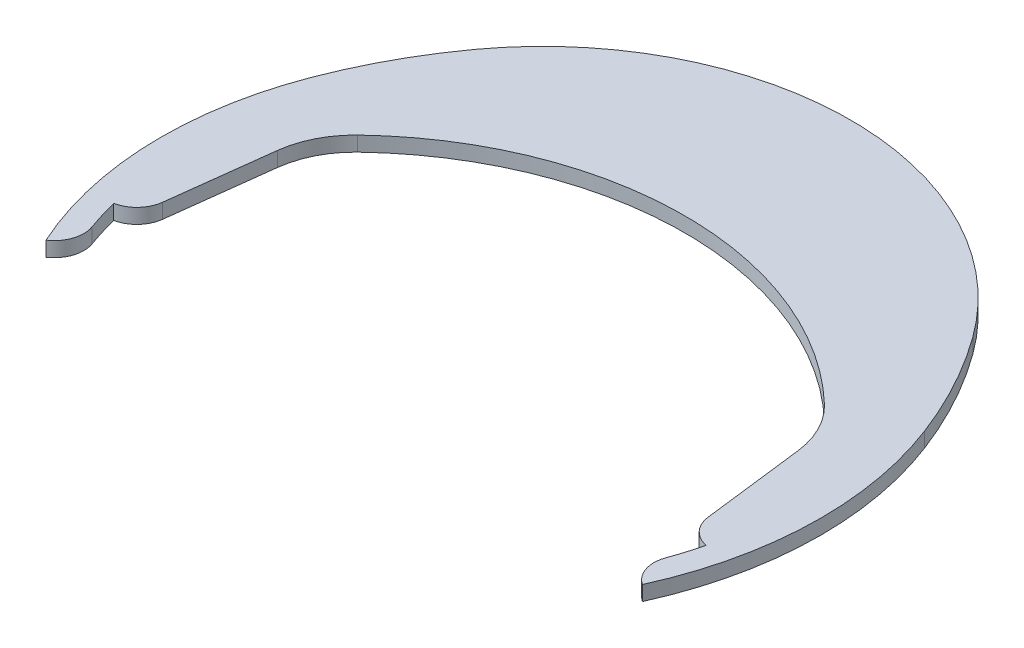
ISO-10303-21;
HEADER;
FILE_DESCRIPTION(('STEP AP214'),'2;1');
FILE_NAME('part.step','',(''),(''),'','','');
FILE_SCHEMA(('AUTOMOTIVE_DESIGN { 1 0 10303 214 1 1 1 1 }'));
ENDSEC;
DATA;
#1=APPLICATION_CONTEXT('core data for automotive mechanical design processes');
#2=APPLICATION_PROTOCOL_DEFINITION('international standard','automotive_design',2000,#1);
#3=PRODUCT_CONTEXT('',#1,'mechanical');
#4=PRODUCT('Part','Part','',(#3));
#5=PRODUCT_RELATED_PRODUCT_CATEGORY('part','',(#4));
#6=PRODUCT_DEFINITION_FORMATION('','',#4);
#7=PRODUCT_DEFINITION_CONTEXT('part definition',#1,'design');
#8=PRODUCT_DEFINITION('design','',#6,#7);
#9=PRODUCT_DEFINITION_SHAPE('','',#8);
#10=(LENGTH_UNIT() NAMED_UNIT(*) SI_UNIT(.MILLI.,.METRE.));
#11=(NAMED_UNIT(*) PLANE_ANGLE_UNIT() SI_UNIT($,.RADIAN.));
#12=(NAMED_UNIT(*) SI_UNIT($,.STERADIAN.) SOLID_ANGLE_UNIT());
#13=UNCERTAINTY_MEASURE_WITH_UNIT(LENGTH_MEASURE(1.E-05),#10,'distance_accuracy_value','');
#14=(GEOMETRIC_REPRESENTATION_CONTEXT(3) GLOBAL_UNCERTAINTY_ASSIGNED_CONTEXT((#13)) GLOBAL_UNIT_ASSIGNED_CONTEXT((#10,
#11,#12)) REPRESENTATION_CONTEXT('',''));
#15=CARTESIAN_POINT('',(0.,0.,0.));
#16=DIRECTION('',(0.,0.,1.));
#17=DIRECTION('',(1.,0.,0.));
#18=AXIS2_PLACEMENT_3D('',#15,#16,#17);
#19=CARTESIAN_POINT('',(0.,15.,-40.));
#20=DIRECTION('',(0.,-1.,0.));
#21=DIRECTION('',(0.,0.,-1.));
#22=AXIS2_PLACEMENT_3D('',#19,#20,#21);
#23=CYLINDRICAL_SURFACE('',#22,104.);
#24=CARTESIAN_POINT('',(0.,10.,-40.));
#25=DIRECTION('',(0.,1.,0.));
#26=DIRECTION('',(0.,0.,1.));
#27=AXIS2_PLACEMENT_3D('',#24,#25,#26);
#28=CIRCLE('',#27,104.);
#29=CARTESIAN_POINT('',(84.137767414994,10.,-101.129666238418));
#30=VERTEX_POINT('',#29);
#31=CARTESIAN_POINT('',(-84.137767414994,10.,-101.129666238418));
#32=VERTEX_POINT('',#31);
#33=EDGE_CURVE('E175',#30,#32,#28,.T.);
#34=ORIENTED_EDGE('',*,*,#33,.T.);
#35=DIRECTION('',(0.,-1.,0.));
#36=VECTOR('',#35,1.);
#37=CARTESIAN_POINT('',(-84.137767414994,15.,-101.129666238418));
#38=LINE('',#37,#36);
#39=CARTESIAN_POINT('',(-84.137767414994,15.,-101.129666238418));
#40=VERTEX_POINT('',#39);
#41=EDGE_CURVE('E11',#40,#32,#38,.T.);
#42=ORIENTED_EDGE('',*,*,#41,.F.);
#43=CARTESIAN_POINT('',(0.,15.,-40.));
#44=DIRECTION('',(0.,1.,0.));
#45=DIRECTION('',(0.,0.,1.));
#46=AXIS2_PLACEMENT_3D('',#43,#44,#45);
#47=CIRCLE('',#46,104.);
#48=CARTESIAN_POINT('',(84.137767414994,15.,-101.129666238418));
#49=VERTEX_POINT('',#48);
#50=EDGE_CURVE('E211',#49,#40,#47,.T.);
#51=ORIENTED_EDGE('',*,*,#50,.F.);
#52=DIRECTION('',(0.,-1.,0.));
#53=VECTOR('',#52,1.);
#54=CARTESIAN_POINT('',(84.137767414994,15.,-101.129666238418));
#55=LINE('',#54,#53);
#56=EDGE_CURVE('E171',#49,#30,#55,.T.);
#57=ORIENTED_EDGE('',*,*,#56,.T.);
#58=EDGE_LOOP('',(#34,#42,#51,#57));
#59=FACE_BOUND('',#58,.T.);
#60=ADVANCED_FACE('F32',(#59),#23,.T.);
#61=CARTESIAN_POINT('',(41.259866713122,15.,-10.0229521330835));
#62=DIRECTION('',(0.,-1.,0.));
#63=DIRECTION('',(0.,0.,-1.));
#64=AXIS2_PLACEMENT_3D('',#61,#62,#63);
#65=CYLINDRICAL_SURFACE('',#64,155.);
#66=CARTESIAN_POINT('',(41.259866713122,10.,-10.0229521330835));
#67=DIRECTION('',(0.,1.,0.));
#68=DIRECTION('',(0.,0.,1.));
#69=AXIS2_PLACEMENT_3D('',#66,#67,#68);
#70=CIRCLE('',#69,155.);
#71=CARTESIAN_POINT('',(-103.445099393944,10.,-65.5699843126063));
#72=VERTEX_POINT('',#71);
#73=EDGE_CURVE('E178',#32,#72,#70,.T.);
#74=ORIENTED_EDGE('',*,*,#73,.T.);
#75=DIRECTION('',(0.,-1.,0.));
#76=VECTOR('',#75,1.);
#77=CARTESIAN_POINT('',(-103.445099393944,15.,-65.5699843126063));
#78=LINE('',#77,#76);
#79=CARTESIAN_POINT('',(-103.445099393944,15.,-65.5699843126063));
#80=VERTEX_POINT('',#79);
#81=EDGE_CURVE('E40',#80,#72,#78,.T.);
#82=ORIENTED_EDGE('',*,*,#81,.F.);
#83=CARTESIAN_POINT('',(41.259866713122,15.,-10.0229521330835));
#84=DIRECTION('',(0.,1.,0.));
#85=DIRECTION('',(0.,0.,1.));
#86=AXIS2_PLACEMENT_3D('',#83,#84,#85);
#87=CIRCLE('',#86,155.);
#88=EDGE_CURVE('E115',#40,#80,#87,.T.);
#89=ORIENTED_EDGE('',*,*,#88,.F.);
#90=ORIENTED_EDGE('',*,*,#41,.T.);
#91=EDGE_LOOP('',(#74,#82,#89,#90));
#92=FACE_BOUND('',#91,.T.);
#93=ADVANCED_FACE('F298',(#92),#65,.T.);
#94=CARTESIAN_POINT('',(8.5845517857201,15.,-22.5658303671692));
#95=DIRECTION('',(0.,-1.,0.));
#96=DIRECTION('',(0.,0.,-1.));
#97=AXIS2_PLACEMENT_3D('',#94,#95,#96);
#98=CYLINDRICAL_SURFACE('',#97,120.);
#99=CARTESIAN_POINT('',(8.5845517857201,10.,-22.5658303671692));
#100=DIRECTION('',(0.,1.,0.));
#101=DIRECTION('',(0.,0.,1.));
#102=AXIS2_PLACEMENT_3D('',#99,#100,#101);
#103=CIRCLE('',#102,120.);
#104=CARTESIAN_POINT('',(-100.704236424052,10.,26.991820622759));
#105=VERTEX_POINT('',#104);
#106=EDGE_CURVE('E180',#72,#105,#103,.T.);
#107=ORIENTED_EDGE('',*,*,#106,.T.);
#108=DIRECTION('',(0.,-1.,0.));
#109=VECTOR('',#108,1.);
#110=CARTESIAN_POINT('',(-100.704236424052,15.,26.991820622759));
#111=LINE('',#110,#109);
#112=CARTESIAN_POINT('',(-100.704236424052,15.,26.991820622759));
#113=VERTEX_POINT('',#112);
#114=EDGE_CURVE('E237',#113,#105,#111,.T.);
#115=ORIENTED_EDGE('',*,*,#114,.F.);
#116=CARTESIAN_POINT('',(8.5845517857201,15.,-22.5658303671692));
#117=DIRECTION('',(0.,1.,0.));
#118=DIRECTION('',(0.,0.,1.));
#119=AXIS2_PLACEMENT_3D('',#116,#117,#118);
#120=CIRCLE('',#119,120.);
#121=EDGE_CURVE('E245',#80,#113,#120,.T.);
#122=ORIENTED_EDGE('',*,*,#121,.F.);
#123=ORIENTED_EDGE('',*,*,#81,.T.);
#124=EDGE_LOOP('',(#107,#115,#122,#123));
#125=FACE_BOUND('',#124,.T.);
#126=ADVANCED_FACE('F243',(#125),#98,.T.);
#127=CARTESIAN_POINT('',(-106.23802030709,15.,18.6625207760836));
#128=DIRECTION('',(0.,-1.,0.));
#129=DIRECTION('',(0.,0.,-1.));
#130=AXIS2_PLACEMENT_3D('',#127,#128,#129);
#131=CYLINDRICAL_SURFACE('',#130,9.99999999999999);
#132=CARTESIAN_POINT('',(-106.23802030709,10.,18.6625207760836));
#133=DIRECTION('',(0.,1.,0.));
#134=DIRECTION('',(0.,0.,1.));
#135=AXIS2_PLACEMENT_3D('',#132,#133,#134);
#136=CIRCLE('',#135,9.99999999999999);
#137=CARTESIAN_POINT('',(-96.8263340699747,10.,15.2831477315546));
#138=VERTEX_POINT('',#137);
#139=EDGE_CURVE('E182',#105,#138,#136,.T.);
#140=ORIENTED_EDGE('',*,*,#139,.T.);
#141=DIRECTION('',(0.,-1.,0.));
#142=VECTOR('',#141,1.);
#143=CARTESIAN_POINT('',(-96.8263340699747,15.,15.2831477315546));
#144=LINE('',#143,#142);
#145=CARTESIAN_POINT('',(-96.8263340699747,15.,15.2831477315546));
#146=VERTEX_POINT('',#145);
#147=EDGE_CURVE('E235',#146,#138,#144,.T.);
#148=ORIENTED_EDGE('',*,*,#147,.F.);
#149=CARTESIAN_POINT('',(-106.23802030709,15.,18.6625207760836));
#150=DIRECTION('',(0.,1.,0.));
#151=DIRECTION('',(0.,0.,1.));
#152=AXIS2_PLACEMENT_3D('',#149,#150,#151);
#153=CIRCLE('',#152,9.99999999999999);
#154=EDGE_CURVE('E257',#113,#146,#153,.T.);
#155=ORIENTED_EDGE('',*,*,#154,.F.);
#156=ORIENTED_EDGE('',*,*,#114,.T.);
#157=EDGE_LOOP('',(#140,#148,#155,#156));
#158=FACE_BOUND('',#157,.T.);
#159=ADVANCED_FACE('F254',(#158),#131,.T.);
#160=CARTESIAN_POINT('',(8.5845517857201,15.,-22.5658303671692));
#161=DIRECTION('',(0.,-1.,0.));
#162=DIRECTION('',(0.,0.,-1.));
#163=AXIS2_PLACEMENT_3D('',#160,#161,#162);
#164=CYLINDRICAL_SURFACE('',#163,112.);
#165=CARTESIAN_POINT('',(8.5845517857201,10.,-22.5658303671692));
#166=DIRECTION('',(0.,1.,0.));
#167=DIRECTION('',(0.,0.,1.));
#168=AXIS2_PLACEMENT_3D('',#165,#166,#167);
#169=CIRCLE('',#168,112.);
#170=CARTESIAN_POINT('',(-100.01861603166,10.,4.80846304891626));
#171=VERTEX_POINT('',#170);
#172=EDGE_CURVE('E185',#171,#138,#169,.T.);
#173=ORIENTED_EDGE('',*,*,#172,.F.);
#174=DIRECTION('',(0.,-1.,0.));
#175=VECTOR('',#174,1.);
#176=CARTESIAN_POINT('',(-100.01861603166,15.,4.80846304891626));
#177=LINE('',#176,#175);
#178=CARTESIAN_POINT('',(-100.01861603166,15.,4.80846304891626));
#179=VERTEX_POINT('',#178);
#180=EDGE_CURVE('E233',#179,#171,#177,.T.);
#181=ORIENTED_EDGE('',*,*,#180,.F.);
#182=CARTESIAN_POINT('',(8.5845517857201,15.,-22.5658303671692));
#183=DIRECTION('',(0.,1.,0.));
#184=DIRECTION('',(0.,0.,1.));
#185=AXIS2_PLACEMENT_3D('',#182,#183,#184);
#186=CIRCLE('',#185,112.);
#187=EDGE_CURVE('E259',#179,#146,#186,.T.);
#188=ORIENTED_EDGE('',*,*,#187,.T.);
#189=ORIENTED_EDGE('',*,*,#147,.T.);
#190=EDGE_LOOP('',(#173,#181,#188,#189));
#191=FACE_BOUND('',#190,.T.);
#192=ADVANCED_FACE('F309',(#191),#164,.F.);
#193=CARTESIAN_POINT('',(-102.027423695161,15.,-4.98769394099881));
#194=DIRECTION('',(0.,-1.,0.));
#195=DIRECTION('',(0.,0.,-1.));
#196=AXIS2_PLACEMENT_3D('',#193,#194,#195);
#197=CYLINDRICAL_SURFACE('',#196,10.);
#198=CARTESIAN_POINT('',(-102.027423695161,10.,-4.98769394099881));
#199=DIRECTION('',(0.,1.,0.));
#200=DIRECTION('',(0.,0.,1.));
#201=AXIS2_PLACEMENT_3D('',#198,#199,#200);
#202=CIRCLE('',#201,10.);
#203=CARTESIAN_POINT('',(-92.1019621787473,10.,-3.76900050694741));
#204=VERTEX_POINT('',#203);
#205=EDGE_CURVE('E188',#171,#204,#202,.T.);
#206=ORIENTED_EDGE('',*,*,#205,.T.);
#207=DIRECTION('',(0.,-1.,0.));
#208=VECTOR('',#207,1.);
#209=CARTESIAN_POINT('',(-92.1019621787473,15.,-3.76900050694741));
#210=LINE('',#209,#208);
#211=CARTESIAN_POINT('',(-92.1019621787473,15.,-3.76900050694741));
#212=VERTEX_POINT('',#211);
#213=EDGE_CURVE('E230',#212,#204,#210,.T.);
#214=ORIENTED_EDGE('',*,*,#213,.F.);
#215=CARTESIAN_POINT('',(-102.027423695161,15.,-4.98769394099881));
#216=DIRECTION('',(0.,1.,0.));
#217=DIRECTION('',(0.,0.,1.));
#218=AXIS2_PLACEMENT_3D('',#215,#216,#217);
#219=CIRCLE('',#218,10.);
#220=EDGE_CURVE('E261',#179,#212,#219,.T.);
#221=ORIENTED_EDGE('',*,*,#220,.F.);
#222=ORIENTED_EDGE('',*,*,#180,.T.);
#223=EDGE_LOOP('',(#206,#214,#221,#222));
#224=FACE_BOUND('',#223,.T.);
#225=ADVANCED_FACE('F312',(#224),#197,.T.);
#226=CARTESIAN_POINT('',(-92.1019621787473,15.,-3.76900050694741));
#227=DIRECTION('',(-0.992546151641323,0.,-0.12186934340514));
#228=DIRECTION('',(-0.12186934340514,0.,0.992546151641323));
#229=AXIS2_PLACEMENT_3D('',#226,#227,#228);
#230=PLANE('',#229);
#231=DIRECTION('',(0.12186934340514,0.,-0.992546151641323));
#232=VECTOR('',#231,1.);
#233=CARTESIAN_POINT('',(-92.1019621787473,10.,-3.76900050694741));
#234=LINE('',#233,#232);
#235=CARTESIAN_POINT('',(-87.8570815581848,10.,-38.3407788262065));
#236=VERTEX_POINT('',#235);
#237=EDGE_CURVE('E190',#204,#236,#234,.T.);
#238=ORIENTED_EDGE('',*,*,#237,.T.);
#239=DIRECTION('',(0.,-1.,0.));
#240=VECTOR('',#239,1.);
#241=CARTESIAN_POINT('',(-87.8570815581848,15.,-38.3407788262065));
#242=LINE('',#241,#240);
#243=CARTESIAN_POINT('',(-87.8570815581848,15.,-38.3407788262065));
#244=VERTEX_POINT('',#243);
#245=EDGE_CURVE('E227',#244,#236,#242,.T.);
#246=ORIENTED_EDGE('',*,*,#245,.F.);
#247=DIRECTION('',(0.12186934340514,0.,-0.992546151641323));
#248=VECTOR('',#247,1.);
#249=CARTESIAN_POINT('',(-92.1019621787473,15.,-3.76900050694741));
#250=LINE('',#249,#248);
#251=EDGE_CURVE('E267',#212,#244,#250,.T.);
#252=ORIENTED_EDGE('',*,*,#251,.F.);
#253=ORIENTED_EDGE('',*,*,#213,.T.);
#254=EDGE_LOOP('',(#238,#246,#252,#253));
#255=FACE_BOUND('',#254,.T.);
#256=ADVANCED_FACE('F316',(#255),#230,.F.);
#257=CARTESIAN_POINT('',(-58.0806970089451,15.,-34.6846985240522));
#258=DIRECTION('',(0.,-1.,0.));
#259=DIRECTION('',(0.,0.,-1.));
#260=AXIS2_PLACEMENT_3D('',#257,#258,#259);
#261=CYLINDRICAL_SURFACE('',#260,30.);
#262=CARTESIAN_POINT('',(-58.0806970089451,10.,-34.6846985240522));
#263=DIRECTION('',(0.,-1.,0.));
#264=DIRECTION('',(0.,0.,-1.));
#265=AXIS2_PLACEMENT_3D('',#262,#263,#264);
#266=CIRCLE('',#265,30.);
#267=CARTESIAN_POINT('',(-78.8238030835684,10.,-56.3578051397852));
#268=VERTEX_POINT('',#267);
#269=EDGE_CURVE('E192',#236,#268,#266,.T.);
#270=ORIENTED_EDGE('',*,*,#269,.T.);
#271=DIRECTION('',(0.,-1.,0.));
#272=VECTOR('',#271,1.);
#273=CARTESIAN_POINT('',(-78.8238030835684,15.,-56.3578051397852));
#274=LINE('',#273,#272);
#275=CARTESIAN_POINT('',(-78.8238030835684,15.,-56.3578051397852));
#276=VERTEX_POINT('',#275);
#277=EDGE_CURVE('E225',#276,#268,#274,.T.);
#278=ORIENTED_EDGE('',*,*,#277,.F.);
#279=CARTESIAN_POINT('',(-58.0806970089451,15.,-34.6846985240522));
#280=DIRECTION('',(0.,-1.,0.));
#281=DIRECTION('',(0.,0.,-1.));
#282=AXIS2_PLACEMENT_3D('',#279,#280,#281);
#283=CIRCLE('',#282,30.);
#284=EDGE_CURVE('E269',#244,#276,#283,.T.);
#285=ORIENTED_EDGE('',*,*,#284,.F.);
#286=ORIENTED_EDGE('',*,*,#245,.T.);
#287=EDGE_LOOP('',(#270,#278,#285,#286));
#288=FACE_BOUND('',#287,.T.);
#289=ADVANCED_FACE('F320',(#288),#261,.F.);
#290=CARTESIAN_POINT('',(0.,15.,26.));
#291=DIRECTION('',(0.,-1.,0.));
#292=DIRECTION('',(0.,0.,-1.));
#293=AXIS2_PLACEMENT_3D('',#290,#291,#292);
#294=CYLINDRICAL_SURFACE('',#293,114.);
#295=CARTESIAN_POINT('',(0.,10.,26.));
#296=DIRECTION('',(0.,1.,0.));
#297=DIRECTION('',(0.,0.,1.));
#298=AXIS2_PLACEMENT_3D('',#295,#296,#297);
#299=CIRCLE('',#298,114.);
#300=CARTESIAN_POINT('',(78.8238030835684,10.,-56.3578051397852));
#301=VERTEX_POINT('',#300);
#302=EDGE_CURVE('E195',#301,#268,#299,.T.);
#303=ORIENTED_EDGE('',*,*,#302,.F.);
#304=DIRECTION('',(0.,-1.,0.));
#305=VECTOR('',#304,1.);
#306=CARTESIAN_POINT('',(78.8238030835684,15.,-56.3578051397852));
#307=LINE('',#306,#305);
#308=CARTESIAN_POINT('',(78.8238030835684,15.,-56.3578051397852));
#309=VERTEX_POINT('',#308);
#310=EDGE_CURVE('E223',#309,#301,#307,.T.);
#311=ORIENTED_EDGE('',*,*,#310,.F.);
#312=CARTESIAN_POINT('',(0.,15.,26.));
#313=DIRECTION('',(0.,1.,0.));
#314=DIRECTION('',(0.,0.,1.));
#315=AXIS2_PLACEMENT_3D('',#312,#313,#314);
#316=CIRCLE('',#315,114.);
#317=EDGE_CURVE('E271',#309,#276,#316,.T.);
#318=ORIENTED_EDGE('',*,*,#317,.T.);
#319=ORIENTED_EDGE('',*,*,#277,.T.);
#320=EDGE_LOOP('',(#303,#311,#318,#319));
#321=FACE_BOUND('',#320,.T.);
#322=ADVANCED_FACE('F324',(#321),#294,.F.);
#323=CARTESIAN_POINT('',(58.0806970089452,15.,-34.6846985240522));
#324=DIRECTION('',(0.,-1.,0.));
#325=DIRECTION('',(0.,0.,-1.));
#326=AXIS2_PLACEMENT_3D('',#323,#324,#325);
#327=CYLINDRICAL_SURFACE('',#326,30.);
#328=CARTESIAN_POINT('',(58.0806970089452,10.,-34.6846985240522));
#329=DIRECTION('',(0.,-1.,0.));
#330=DIRECTION('',(0.,0.,-1.));
#331=AXIS2_PLACEMENT_3D('',#328,#329,#330);
#332=CIRCLE('',#331,30.);
#333=CARTESIAN_POINT('',(87.8570815581848,10.,-38.3407788262064));
#334=VERTEX_POINT('',#333);
#335=EDGE_CURVE('E198',#301,#334,#332,.T.);
#336=ORIENTED_EDGE('',*,*,#335,.T.);
#337=DIRECTION('',(0.,-1.,0.));
#338=VECTOR('',#337,1.);
#339=CARTESIAN_POINT('',(87.8570815581848,15.,-38.3407788262064));
#340=LINE('',#339,#338);
#341=CARTESIAN_POINT('',(87.8570815581848,15.,-38.3407788262064));
#342=VERTEX_POINT('',#341);
#343=EDGE_CURVE('E220',#342,#334,#340,.T.);
#344=ORIENTED_EDGE('',*,*,#343,.F.);
#345=CARTESIAN_POINT('',(58.0806970089452,15.,-34.6846985240522));
#346=DIRECTION('',(0.,-1.,0.));
#347=DIRECTION('',(0.,0.,-1.));
#348=AXIS2_PLACEMENT_3D('',#345,#346,#347);
#349=CIRCLE('',#348,30.);
#350=EDGE_CURVE('E274',#309,#342,#349,.T.);
#351=ORIENTED_EDGE('',*,*,#350,.F.);
#352=ORIENTED_EDGE('',*,*,#310,.T.);
#353=EDGE_LOOP('',(#336,#344,#351,#352));
#354=FACE_BOUND('',#353,.T.);
#355=ADVANCED_FACE('F328',(#354),#327,.F.);
#356=CARTESIAN_POINT('',(87.8570815581848,15.,-38.3407788262064));
#357=DIRECTION('',(0.992546151641323,0.,-0.12186934340514));
#358=DIRECTION('',(-0.12186934340514,0.,-0.992546151641323));
#359=AXIS2_PLACEMENT_3D('',#356,#357,#358);
#360=PLANE('',#359);
#361=DIRECTION('',(0.12186934340514,0.,0.992546151641323));
#362=VECTOR('',#361,1.);
#363=CARTESIAN_POINT('',(87.8570815581848,10.,-38.3407788262064));
#364=LINE('',#363,#362);
#365=CARTESIAN_POINT('',(92.1019621787473,10.,-3.76900050694741));
#366=VERTEX_POINT('',#365);
#367=EDGE_CURVE('E200',#334,#366,#364,.T.);
#368=ORIENTED_EDGE('',*,*,#367,.T.);
#369=DIRECTION('',(0.,-1.,0.));
#370=VECTOR('',#369,1.);
#371=CARTESIAN_POINT('',(92.1019621787473,15.,-3.76900050694741));
#372=LINE('',#371,#370);
#373=CARTESIAN_POINT('',(92.1019621787473,15.,-3.76900050694741));
#374=VERTEX_POINT('',#373);
#375=EDGE_CURVE('E217',#374,#366,#372,.T.);
#376=ORIENTED_EDGE('',*,*,#375,.F.);
#377=DIRECTION('',(0.12186934340514,0.,0.992546151641323));
#378=VECTOR('',#377,1.);
#379=CARTESIAN_POINT('',(87.8570815581848,15.,-38.3407788262064));
#380=LINE('',#379,#378);
#381=EDGE_CURVE('E276',#342,#374,#380,.T.);
#382=ORIENTED_EDGE('',*,*,#381,.F.);
#383=ORIENTED_EDGE('',*,*,#343,.T.);
#384=EDGE_LOOP('',(#368,#376,#382,#383));
#385=FACE_BOUND('',#384,.T.);
#386=ADVANCED_FACE('F332',(#385),#360,.F.);
#387=CARTESIAN_POINT('',(102.027423695161,15.,-4.98769394099881));
#388=DIRECTION('',(0.,-1.,0.));
#389=DIRECTION('',(0.,0.,-1.));
#390=AXIS2_PLACEMENT_3D('',#387,#388,#389);
#391=CYLINDRICAL_SURFACE('',#390,10.);
#392=CARTESIAN_POINT('',(102.027423695161,10.,-4.98769394099881));
#393=DIRECTION('',(0.,1.,0.));
#394=DIRECTION('',(0.,0.,1.));
#395=AXIS2_PLACEMENT_3D('',#392,#393,#394);
#396=CIRCLE('',#395,10.);
#397=CARTESIAN_POINT('',(100.01861603166,10.,4.80846304891629));
#398=VERTEX_POINT('',#397);
#399=EDGE_CURVE('E202',#366,#398,#396,.T.);
#400=ORIENTED_EDGE('',*,*,#399,.T.);
#401=DIRECTION('',(0.,-1.,0.));
#402=VECTOR('',#401,1.);
#403=CARTESIAN_POINT('',(100.01861603166,15.,4.80846304891629));
#404=LINE('',#403,#402);
#405=CARTESIAN_POINT('',(100.01861603166,15.,4.80846304891629));
#406=VERTEX_POINT('',#405);
#407=EDGE_CURVE('E215',#406,#398,#404,.T.);
#408=ORIENTED_EDGE('',*,*,#407,.F.);
#409=CARTESIAN_POINT('',(102.027423695161,15.,-4.98769394099881));
#410=DIRECTION('',(0.,1.,0.));
#411=DIRECTION('',(0.,0.,1.));
#412=AXIS2_PLACEMENT_3D('',#409,#410,#411);
#413=CIRCLE('',#412,10.);
#414=EDGE_CURVE('E278',#374,#406,#413,.T.);
#415=ORIENTED_EDGE('',*,*,#414,.F.);
#416=ORIENTED_EDGE('',*,*,#375,.T.);
#417=EDGE_LOOP('',(#400,#408,#415,#416));
#418=FACE_BOUND('',#417,.T.);
#419=ADVANCED_FACE('F336',(#418),#391,.T.);
#420=CARTESIAN_POINT('',(-8.5845517857201,15.,-22.5658303671692));
#421=DIRECTION('',(0.,-1.,0.));
#422=DIRECTION('',(0.,0.,-1.));
#423=AXIS2_PLACEMENT_3D('',#420,#421,#422);
#424=CYLINDRICAL_SURFACE('',#423,112.);
#425=CARTESIAN_POINT('',(-8.5845517857201,10.,-22.5658303671692));
#426=DIRECTION('',(0.,1.,0.));
#427=DIRECTION('',(0.,0.,1.));
#428=AXIS2_PLACEMENT_3D('',#425,#426,#427);
#429=CIRCLE('',#428,112.);
#430=CARTESIAN_POINT('',(96.8263340699748,10.,15.2831477315546));
#431=VERTEX_POINT('',#430);
#432=EDGE_CURVE('E205',#431,#398,#429,.T.);
#433=ORIENTED_EDGE('',*,*,#432,.F.);
#434=DIRECTION('',(0.,-1.,0.));
#435=VECTOR('',#434,1.);
#436=CARTESIAN_POINT('',(96.8263340699748,15.,15.2831477315546));
#437=LINE('',#436,#435);
#438=CARTESIAN_POINT('',(96.8263340699748,15.,15.2831477315546));
#439=VERTEX_POINT('',#438);
#440=EDGE_CURVE('E166',#439,#431,#437,.T.);
#441=ORIENTED_EDGE('',*,*,#440,.F.);
#442=CARTESIAN_POINT('',(-8.5845517857201,15.,-22.5658303671692));
#443=DIRECTION('',(0.,1.,0.));
#444=DIRECTION('',(0.,0.,1.));
#445=AXIS2_PLACEMENT_3D('',#442,#443,#444);
#446=CIRCLE('',#445,112.);
#447=EDGE_CURVE('E159',#439,#406,#446,.T.);
#448=ORIENTED_EDGE('',*,*,#447,.T.);
#449=ORIENTED_EDGE('',*,*,#407,.T.);
#450=EDGE_LOOP('',(#433,#441,#448,#449));
#451=FACE_BOUND('',#450,.T.);
#452=ADVANCED_FACE('F281',(#451),#424,.F.);
#453=CARTESIAN_POINT('',(106.23802030709,15.,18.6625207760835));
#454=DIRECTION('',(0.,-1.,0.));
#455=DIRECTION('',(0.,0.,-1.));
#456=AXIS2_PLACEMENT_3D('',#453,#454,#455);
#457=CYLINDRICAL_SURFACE('',#456,10.);
#458=CARTESIAN_POINT('',(106.23802030709,10.,18.6625207760835));
#459=DIRECTION('',(0.,1.,0.));
#460=DIRECTION('',(0.,0.,1.));
#461=AXIS2_PLACEMENT_3D('',#458,#459,#460);
#462=CIRCLE('',#461,10.);
#463=CARTESIAN_POINT('',(100.704236424052,10.,26.991820622759));
#464=VERTEX_POINT('',#463);
#465=EDGE_CURVE('E165',#431,#464,#462,.T.);
#466=ORIENTED_EDGE('',*,*,#465,.T.);
#467=DIRECTION('',(0.,-1.,0.));
#468=VECTOR('',#467,1.);
#469=CARTESIAN_POINT('',(100.704236424052,15.,26.991820622759));
#470=LINE('',#469,#468);
#471=CARTESIAN_POINT('',(100.704236424052,15.,26.991820622759));
#472=VERTEX_POINT('',#471);
#473=EDGE_CURVE('E162',#472,#464,#470,.T.);
#474=ORIENTED_EDGE('',*,*,#473,.F.);
#475=CARTESIAN_POINT('',(106.23802030709,15.,18.6625207760835));
#476=DIRECTION('',(0.,1.,0.));
#477=DIRECTION('',(0.,0.,1.));
#478=AXIS2_PLACEMENT_3D('',#475,#476,#477);
#479=CIRCLE('',#478,10.);
#480=EDGE_CURVE('E153',#439,#472,#479,.T.);
#481=ORIENTED_EDGE('',*,*,#480,.F.);
#482=ORIENTED_EDGE('',*,*,#440,.T.);
#483=EDGE_LOOP('',(#466,#474,#481,#482));
#484=FACE_BOUND('',#483,.T.);
#485=ADVANCED_FACE('F163',(#484),#457,.T.);
#486=CARTESIAN_POINT('',(-8.5845517857201,15.,-22.5658303671692));
#487=DIRECTION('',(0.,-1.,0.));
#488=DIRECTION('',(0.,0.,-1.));
#489=AXIS2_PLACEMENT_3D('',#486,#487,#488);
#490=CYLINDRICAL_SURFACE('',#489,120.);
#491=CARTESIAN_POINT('',(-8.5845517857201,10.,-22.5658303671692));
#492=DIRECTION('',(0.,1.,0.));
#493=DIRECTION('',(0.,0.,1.));
#494=AXIS2_PLACEMENT_3D('',#491,#492,#493);
#495=CIRCLE('',#494,120.);
#496=CARTESIAN_POINT('',(103.445099393944,10.,-65.5699843126062));
#497=VERTEX_POINT('',#496);
#498=EDGE_CURVE('E101',#464,#497,#495,.T.);
#499=ORIENTED_EDGE('',*,*,#498,.T.);
#500=DIRECTION('',(0.,-1.,0.));
#501=VECTOR('',#500,1.);
#502=CARTESIAN_POINT('',(103.445099393944,15.,-65.5699843126062));
#503=LINE('',#502,#501);
#504=CARTESIAN_POINT('',(103.445099393944,15.,-65.5699843126062));
#505=VERTEX_POINT('',#504);
#506=EDGE_CURVE('E167',#505,#497,#503,.T.);
#507=ORIENTED_EDGE('',*,*,#506,.F.);
#508=CARTESIAN_POINT('',(-8.5845517857201,15.,-22.5658303671692));
#509=DIRECTION('',(0.,1.,0.));
#510=DIRECTION('',(0.,0.,1.));
#511=AXIS2_PLACEMENT_3D('',#508,#509,#510);
#512=CIRCLE('',#511,120.);
#513=EDGE_CURVE('E157',#472,#505,#512,.T.);
#514=ORIENTED_EDGE('',*,*,#513,.F.);
#515=ORIENTED_EDGE('',*,*,#473,.T.);
#516=EDGE_LOOP('',(#499,#507,#514,#515));
#517=FACE_BOUND('',#516,.T.);
#518=ADVANCED_FACE('F169',(#517),#490,.T.);
#519=CARTESIAN_POINT('',(-41.2598667131221,15.,-10.0229521330835));
#520=DIRECTION('',(0.,-1.,0.));
#521=DIRECTION('',(0.,0.,-1.));
#522=AXIS2_PLACEMENT_3D('',#519,#520,#521);
#523=CYLINDRICAL_SURFACE('',#522,155.);
#524=CARTESIAN_POINT('',(-41.2598667131221,10.,-10.0229521330835));
#525=DIRECTION('',(0.,1.,0.));
#526=DIRECTION('',(0.,0.,1.));
#527=AXIS2_PLACEMENT_3D('',#524,#525,#526);
#528=CIRCLE('',#527,155.);
#529=EDGE_CURVE('E107',#497,#30,#528,.T.);
#530=ORIENTED_EDGE('',*,*,#529,.T.);
#531=ORIENTED_EDGE('',*,*,#56,.F.);
#532=CARTESIAN_POINT('',(-41.2598667131221,15.,-10.0229521330835));
#533=DIRECTION('',(0.,1.,0.));
#534=DIRECTION('',(0.,0.,1.));
#535=AXIS2_PLACEMENT_3D('',#532,#533,#534);
#536=CIRCLE('',#535,155.);
#537=EDGE_CURVE('E48',#505,#49,#536,.T.);
#538=ORIENTED_EDGE('',*,*,#537,.F.);
#539=ORIENTED_EDGE('',*,*,#506,.T.);
#540=EDGE_LOOP('',(#530,#531,#538,#539));
#541=FACE_BOUND('',#540,.T.);
#542=ADVANCED_FACE('F287',(#541),#523,.T.);
#543=CARTESIAN_POINT('',(0.,15.,-40.));
#544=DIRECTION('',(0.,1.,0.));
#545=DIRECTION('',(0.,0.,1.));
#546=AXIS2_PLACEMENT_3D('',#543,#544,#545);
#547=PLANE('',#546);
#548=ORIENTED_EDGE('',*,*,#50,.T.);
#549=ORIENTED_EDGE('',*,*,#88,.T.);
#550=ORIENTED_EDGE('',*,*,#121,.T.);
#551=ORIENTED_EDGE('',*,*,#154,.T.);
#552=ORIENTED_EDGE('',*,*,#187,.F.);
#553=ORIENTED_EDGE('',*,*,#220,.T.);
#554=ORIENTED_EDGE('',*,*,#251,.T.);
#555=ORIENTED_EDGE('',*,*,#284,.T.);
#556=ORIENTED_EDGE('',*,*,#317,.F.);
#557=ORIENTED_EDGE('',*,*,#350,.T.);
#558=ORIENTED_EDGE('',*,*,#381,.T.);
#559=ORIENTED_EDGE('',*,*,#414,.T.);
#560=ORIENTED_EDGE('',*,*,#447,.F.);
#561=ORIENTED_EDGE('',*,*,#480,.T.);
#562=ORIENTED_EDGE('',*,*,#513,.T.);
#563=ORIENTED_EDGE('',*,*,#537,.T.);
#564=EDGE_LOOP('',(#548,#549,#550,#551,#552,#553,#554,#555,#556,#557,#558,#559,#560,#561,#562,#563));
#565=FACE_BOUND('',#564,.T.);
#566=ADVANCED_FACE('F155',(#565),#547,.T.);
#567=CARTESIAN_POINT('',(0.,10.,-40.));
#568=DIRECTION('',(0.,1.,0.));
#569=DIRECTION('',(0.,0.,1.));
#570=AXIS2_PLACEMENT_3D('',#567,#568,#569);
#571=PLANE('',#570);
#572=ORIENTED_EDGE('',*,*,#33,.F.);
#573=ORIENTED_EDGE('',*,*,#529,.F.);
#574=ORIENTED_EDGE('',*,*,#498,.F.);
#575=ORIENTED_EDGE('',*,*,#465,.F.);
#576=ORIENTED_EDGE('',*,*,#432,.T.);
#577=ORIENTED_EDGE('',*,*,#399,.F.);
#578=ORIENTED_EDGE('',*,*,#367,.F.);
#579=ORIENTED_EDGE('',*,*,#335,.F.);
#580=ORIENTED_EDGE('',*,*,#302,.T.);
#581=ORIENTED_EDGE('',*,*,#269,.F.);
#582=ORIENTED_EDGE('',*,*,#237,.F.);
#583=ORIENTED_EDGE('',*,*,#205,.F.);
#584=ORIENTED_EDGE('',*,*,#172,.T.);
#585=ORIENTED_EDGE('',*,*,#139,.F.);
#586=ORIENTED_EDGE('',*,*,#106,.F.);
#587=ORIENTED_EDGE('',*,*,#73,.F.);
#588=EDGE_LOOP('',(#572,#573,#574,#575,#576,#577,#578,#579,#580,#581,#582,#583,#584,#585,#586,#587));
#589=FACE_BOUND('',#588,.T.);
#590=ADVANCED_FACE('F249',(#589),#571,.F.);
#591=CLOSED_SHELL('',(#60,#93,#126,#159,#192,#225,#256,#289,#322,#355,#386,#419,#452,#485,#518,
#542,#566,#590));
#592=MANIFOLD_SOLID_BREP('B2',#591);
#593=ADVANCED_BREP_SHAPE_REPRESENTATION('',(#18,#592),#14);
#594=SHAPE_DEFINITION_REPRESENTATION(#9,#593);
ENDSEC;
END-ISO-10303-21;
